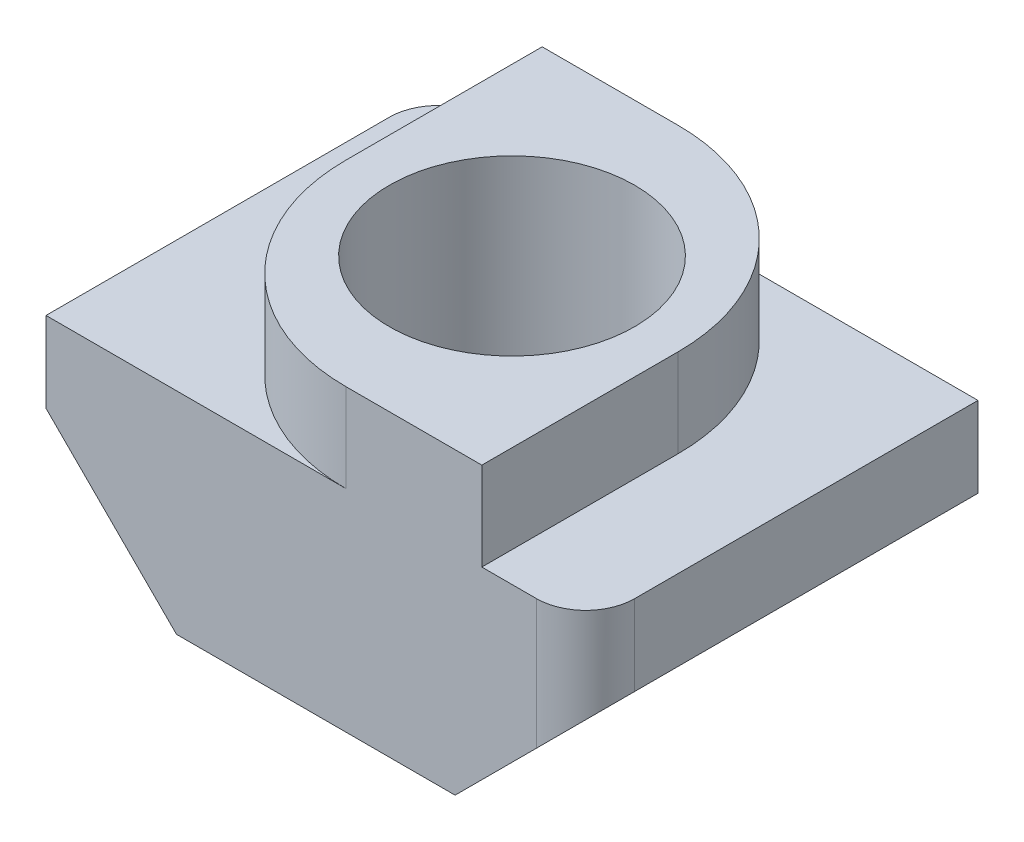
ISO-10303-21;
HEADER;
FILE_DESCRIPTION(('STEP AP214'),'2;1');
FILE_NAME('part.step','',(''),(''),'','','');
FILE_SCHEMA(('AUTOMOTIVE_DESIGN { 1 0 10303 214 1 1 1 1 }'));
ENDSEC;
DATA;
#1=APPLICATION_CONTEXT('core data for automotive mechanical design processes');
#2=APPLICATION_PROTOCOL_DEFINITION('international standard','automotive_design',2000,#1);
#3=PRODUCT_CONTEXT('',#1,'mechanical');
#4=PRODUCT('Part','Part','',(#3));
#5=PRODUCT_RELATED_PRODUCT_CATEGORY('part','',(#4));
#6=PRODUCT_DEFINITION_FORMATION('','',#4);
#7=PRODUCT_DEFINITION_CONTEXT('part definition',#1,'design');
#8=PRODUCT_DEFINITION('design','',#6,#7);
#9=PRODUCT_DEFINITION_SHAPE('','',#8);
#10=(LENGTH_UNIT() NAMED_UNIT(*) SI_UNIT(.MILLI.,.METRE.));
#11=(NAMED_UNIT(*) PLANE_ANGLE_UNIT() SI_UNIT($,.RADIAN.));
#12=(NAMED_UNIT(*) SI_UNIT($,.STERADIAN.) SOLID_ANGLE_UNIT());
#13=UNCERTAINTY_MEASURE_WITH_UNIT(LENGTH_MEASURE(1.E-05),#10,'distance_accuracy_value','');
#14=(GEOMETRIC_REPRESENTATION_CONTEXT(3) GLOBAL_UNCERTAINTY_ASSIGNED_CONTEXT((#13)) GLOBAL_UNIT_ASSIGNED_CONTEXT((#10,
#11,#12)) REPRESENTATION_CONTEXT('',''));
#15=CARTESIAN_POINT('',(0.,0.,0.));
#16=DIRECTION('',(0.,0.,1.));
#17=DIRECTION('',(1.,0.,0.));
#18=AXIS2_PLACEMENT_3D('',#15,#16,#17);
#19=CARTESIAN_POINT('',(0.,4.3,0.));
#20=DIRECTION('',(0.,-1.,0.));
#21=DIRECTION('',(0.,0.,-1.));
#22=AXIS2_PLACEMENT_3D('',#19,#20,#21);
#23=PLANE('',#22);
#24=DIRECTION('',(1.,0.,0.));
#25=VECTOR('',#24,1.);
#26=CARTESIAN_POINT('',(-5.5,4.3,4.));
#27=LINE('',#26,#25);
#28=CARTESIAN_POINT('',(3.385,4.3,4.));
#29=VERTEX_POINT('',#28);
#30=CARTESIAN_POINT('',(4.5,4.3,4.));
#31=VERTEX_POINT('',#30);
#32=EDGE_CURVE('E255',#29,#31,#27,.T.);
#33=ORIENTED_EDGE('',*,*,#32,.T.);
#34=CARTESIAN_POINT('',(4.5,4.3,3.));
#35=DIRECTION('',(0.,-1.,0.));
#36=DIRECTION('',(0.,0.,-1.));
#37=AXIS2_PLACEMENT_3D('',#34,#35,#36);
#38=CIRCLE('',#37,1.);
#39=CARTESIAN_POINT('',(5.5,4.3,3.));
#40=VERTEX_POINT('',#39);
#41=EDGE_CURVE('E203',#31,#40,#38,.F.);
#42=ORIENTED_EDGE('',*,*,#41,.T.);
#43=DIRECTION('',(0.,0.,-1.));
#44=VECTOR('',#43,1.);
#45=CARTESIAN_POINT('',(5.5,4.3,4.));
#46=LINE('',#45,#44);
#47=CARTESIAN_POINT('',(5.5,4.3,-4.));
#48=VERTEX_POINT('',#47);
#49=EDGE_CURVE('E233',#40,#48,#46,.T.);
#50=ORIENTED_EDGE('',*,*,#49,.T.);
#51=DIRECTION('',(-1.,0.,0.));
#52=VECTOR('',#51,1.);
#53=CARTESIAN_POINT('',(-5.5,4.3,-4.));
#54=LINE('',#53,#52);
#55=CARTESIAN_POINT('',(-0.615,4.3,-4.));
#56=VERTEX_POINT('',#55);
#57=EDGE_CURVE('E243',#48,#56,#54,.T.);
#58=ORIENTED_EDGE('',*,*,#57,.T.);
#59=CARTESIAN_POINT('',(-0.615,4.3,0.));
#60=DIRECTION('',(0.,-1.,0.));
#61=DIRECTION('',(0.,0.,-1.));
#62=AXIS2_PLACEMENT_3D('',#59,#60,#61);
#63=CIRCLE('',#62,4.);
#64=CARTESIAN_POINT('',(3.385,4.3,0.));
#65=VERTEX_POINT('',#64);
#66=EDGE_CURVE('E192',#56,#65,#63,.T.);
#67=ORIENTED_EDGE('',*,*,#66,.T.);
#68=DIRECTION('',(0.,0.,-1.));
#69=VECTOR('',#68,1.);
#70=CARTESIAN_POINT('',(3.385,4.3,4.));
#71=LINE('',#70,#69);
#72=EDGE_CURVE('E169',#29,#65,#71,.T.);
#73=ORIENTED_EDGE('',*,*,#72,.F.);
#74=EDGE_LOOP('',(#33,#42,#50,#58,#67,#73));
#75=FACE_BOUND('',#74,.T.);
#76=ADVANCED_FACE('F32',(#75),#23,.F.);
#77=CARTESIAN_POINT('',(-3.385,4.3,-4.));
#78=VERTEX_POINT('',#77);
#79=CARTESIAN_POINT('',(-4.5,4.3,-4.));
#80=VERTEX_POINT('',#79);
#81=EDGE_CURVE('E150',#78,#80,#54,.T.);
#82=ORIENTED_EDGE('',*,*,#81,.T.);
#83=CARTESIAN_POINT('',(-4.5,4.3,-3.));
#84=DIRECTION('',(0.,-1.,0.));
#85=DIRECTION('',(0.,0.,-1.));
#86=AXIS2_PLACEMENT_3D('',#83,#84,#85);
#87=CIRCLE('',#86,1.);
#88=CARTESIAN_POINT('',(-5.5,4.3,-3.));
#89=VERTEX_POINT('',#88);
#90=EDGE_CURVE('E11',#80,#89,#87,.F.);
#91=ORIENTED_EDGE('',*,*,#90,.T.);
#92=DIRECTION('',(0.,0.,1.));
#93=VECTOR('',#92,1.);
#94=CARTESIAN_POINT('',(-5.5,4.3,4.));
#95=LINE('',#94,#93);
#96=CARTESIAN_POINT('',(-5.5,4.3,4.));
#97=VERTEX_POINT('',#96);
#98=EDGE_CURVE('E215',#89,#97,#95,.T.);
#99=ORIENTED_EDGE('',*,*,#98,.T.);
#100=CARTESIAN_POINT('',(0.615,4.3,4.));
#101=VERTEX_POINT('',#100);
#102=EDGE_CURVE('E249',#97,#101,#27,.T.);
#103=ORIENTED_EDGE('',*,*,#102,.T.);
#104=CARTESIAN_POINT('',(0.615,4.3,0.));
#105=DIRECTION('',(0.,-1.,0.));
#106=DIRECTION('',(0.,0.,-1.));
#107=AXIS2_PLACEMENT_3D('',#104,#105,#106);
#108=CIRCLE('',#107,4.);
#109=CARTESIAN_POINT('',(-3.385,4.3,0.));
#110=VERTEX_POINT('',#109);
#111=EDGE_CURVE('E194',#101,#110,#108,.T.);
#112=ORIENTED_EDGE('',*,*,#111,.T.);
#113=DIRECTION('',(0.,0.,1.));
#114=VECTOR('',#113,1.);
#115=CARTESIAN_POINT('',(-3.385,4.3,4.));
#116=LINE('',#115,#114);
#117=EDGE_CURVE('E173',#78,#110,#116,.T.);
#118=ORIENTED_EDGE('',*,*,#117,.F.);
#119=EDGE_LOOP('',(#82,#91,#99,#103,#112,#118));
#120=FACE_BOUND('',#119,.T.);
#121=ADVANCED_FACE('F264',(#120),#23,.F.);
#122=CARTESIAN_POINT('',(0.,0.,0.));
#123=DIRECTION('',(0.,-1.,0.));
#124=DIRECTION('',(0.,0.,-1.));
#125=AXIS2_PLACEMENT_3D('',#122,#123,#124);
#126=PLANE('',#125);
#127=DIRECTION('',(0.,0.,1.));
#128=VECTOR('',#127,1.);
#129=CARTESIAN_POINT('',(2.84000000000001,0.,-4.));
#130=LINE('',#129,#128);
#131=CARTESIAN_POINT('',(2.84000000000001,0.,-4.));
#132=VERTEX_POINT('',#131);
#133=CARTESIAN_POINT('',(2.84000000000001,0.,4.));
#134=VERTEX_POINT('',#133);
#135=EDGE_CURVE('E341',#132,#134,#130,.T.);
#136=ORIENTED_EDGE('',*,*,#135,.T.);
#137=DIRECTION('',(1.,0.,0.));
#138=VECTOR('',#137,1.);
#139=CARTESIAN_POINT('',(-5.5,0.,4.));
#140=LINE('',#139,#138);
#141=CARTESIAN_POINT('',(-2.84000000000001,0.,4.));
#142=VERTEX_POINT('',#141);
#143=EDGE_CURVE('E235',#142,#134,#140,.T.);
#144=ORIENTED_EDGE('',*,*,#143,.F.);
#145=DIRECTION('',(0.,0.,1.));
#146=VECTOR('',#145,1.);
#147=CARTESIAN_POINT('',(-2.84000000000001,0.,-4.));
#148=LINE('',#147,#146);
#149=CARTESIAN_POINT('',(-2.84000000000001,0.,-4.));
#150=VERTEX_POINT('',#149);
#151=EDGE_CURVE('E223',#150,#142,#148,.T.);
#152=ORIENTED_EDGE('',*,*,#151,.F.);
#153=DIRECTION('',(-1.,0.,0.));
#154=VECTOR('',#153,1.);
#155=CARTESIAN_POINT('',(-5.5,0.,-4.));
#156=LINE('',#155,#154);
#157=EDGE_CURVE('E226',#132,#150,#156,.T.);
#158=ORIENTED_EDGE('',*,*,#157,.F.);
#159=EDGE_LOOP('',(#136,#144,#152,#158));
#160=FACE_BOUND('',#159,.T.);
#161=CARTESIAN_POINT('',(0.,0.,0.));
#162=DIRECTION('',(0.,1.,0.));
#163=DIRECTION('',(0.,0.,1.));
#164=AXIS2_PLACEMENT_3D('',#161,#162,#163);
#165=CIRCLE('',#164,2.5);
#166=CARTESIAN_POINT('',(0.,0.,-2.5));
#167=VERTEX_POINT('',#166);
#168=EDGE_CURVE('E222',#167,#167,#165,.T.);
#169=ORIENTED_EDGE('',*,*,#168,.T.);
#170=EDGE_LOOP('',(#169));
#171=FACE_BOUND('',#170,.T.);
#172=ADVANCED_FACE('F297',(#160,#171),#126,.T.);
#173=CARTESIAN_POINT('',(5.5,4.3,4.));
#174=DIRECTION('',(-1.,0.,0.));
#175=DIRECTION('',(0.,0.,1.));
#176=AXIS2_PLACEMENT_3D('',#173,#174,#175);
#177=PLANE('',#176);
#178=ORIENTED_EDGE('',*,*,#49,.F.);
#179=DIRECTION('',(0.,-1.,0.));
#180=VECTOR('',#179,1.);
#181=CARTESIAN_POINT('',(5.5,4.3,3.));
#182=LINE('',#181,#180);
#183=CARTESIAN_POINT('',(5.5,2.66,3.));
#184=VERTEX_POINT('',#183);
#185=EDGE_CURVE('E196',#40,#184,#182,.T.);
#186=ORIENTED_EDGE('',*,*,#185,.T.);
#187=DIRECTION('',(0.,0.,1.));
#188=VECTOR('',#187,1.);
#189=CARTESIAN_POINT('',(5.5,2.66,-4.));
#190=LINE('',#189,#188);
#191=CARTESIAN_POINT('',(5.5,2.66,-4.));
#192=VERTEX_POINT('',#191);
#193=EDGE_CURVE('E332',#192,#184,#190,.T.);
#194=ORIENTED_EDGE('',*,*,#193,.F.);
#195=DIRECTION('',(0.,-1.,0.));
#196=VECTOR('',#195,1.);
#197=CARTESIAN_POINT('',(5.5,4.3,-4.));
#198=LINE('',#197,#196);
#199=EDGE_CURVE('E183',#48,#192,#198,.T.);
#200=ORIENTED_EDGE('',*,*,#199,.F.);
#201=EDGE_LOOP('',(#178,#186,#194,#200));
#202=FACE_BOUND('',#201,.T.);
#203=ADVANCED_FACE('F303',(#202),#177,.F.);
#204=CARTESIAN_POINT('',(-5.5,4.3,-4.));
#205=DIRECTION('',(0.,0.,1.));
#206=DIRECTION('',(1.,0.,0.));
#207=AXIS2_PLACEMENT_3D('',#204,#205,#206);
#208=PLANE('',#207);
#209=DIRECTION('',(-0.707106781186546,0.707106781186549,0.));
#210=VECTOR('',#209,1.);
#211=CARTESIAN_POINT('',(-5.5,2.66,-4.));
#212=LINE('',#211,#210);
#213=CARTESIAN_POINT('',(-4.5,1.66,-4.));
#214=VERTEX_POINT('',#213);
#215=EDGE_CURVE('E228',#150,#214,#212,.T.);
#216=ORIENTED_EDGE('',*,*,#215,.T.);
#217=DIRECTION('',(0.,-1.,0.));
#218=VECTOR('',#217,1.);
#219=CARTESIAN_POINT('',(-4.5,4.3,-4.));
#220=LINE('',#219,#218);
#221=EDGE_CURVE('E40',#214,#80,#220,.F.);
#222=ORIENTED_EDGE('',*,*,#221,.T.);
#223=ORIENTED_EDGE('',*,*,#81,.F.);
#224=DIRECTION('',(0.,-1.,0.));
#225=VECTOR('',#224,1.);
#226=CARTESIAN_POINT('',(-3.385,6.1,-4.));
#227=LINE('',#226,#225);
#228=CARTESIAN_POINT('',(-3.385,6.1,-4.));
#229=VERTEX_POINT('',#228);
#230=EDGE_CURVE('E148',#229,#78,#227,.T.);
#231=ORIENTED_EDGE('',*,*,#230,.F.);
#232=DIRECTION('',(-1.,0.,0.));
#233=VECTOR('',#232,1.);
#234=CARTESIAN_POINT('',(-3.385,6.1,-4.));
#235=LINE('',#234,#233);
#236=CARTESIAN_POINT('',(-0.615,6.1,-4.));
#237=VERTEX_POINT('',#236);
#238=EDGE_CURVE('E133',#237,#229,#235,.T.);
#239=ORIENTED_EDGE('',*,*,#238,.F.);
#240=DIRECTION('',(0.,-1.,0.));
#241=VECTOR('',#240,1.);
#242=CARTESIAN_POINT('',(-0.615,4.3,-4.));
#243=LINE('',#242,#241);
#244=EDGE_CURVE('E180',#237,#56,#243,.T.);
#245=ORIENTED_EDGE('',*,*,#244,.T.);
#246=ORIENTED_EDGE('',*,*,#57,.F.);
#247=ORIENTED_EDGE('',*,*,#199,.T.);
#248=DIRECTION('',(-0.707106781186547,-0.707106781186548,0.));
#249=VECTOR('',#248,1.);
#250=CARTESIAN_POINT('',(5.5,2.66,-4.));
#251=LINE('',#250,#249);
#252=EDGE_CURVE('E334',#192,#132,#251,.T.);
#253=ORIENTED_EDGE('',*,*,#252,.T.);
#254=ORIENTED_EDGE('',*,*,#157,.T.);
#255=EDGE_LOOP('',(#216,#222,#223,#231,#239,#245,#246,#247,#253,#254));
#256=FACE_BOUND('',#255,.T.);
#257=ADVANCED_FACE('F149',(#256),#208,.F.);
#258=CARTESIAN_POINT('',(-5.5,4.3,4.));
#259=DIRECTION('',(1.,0.,0.));
#260=DIRECTION('',(0.,0.,-1.));
#261=AXIS2_PLACEMENT_3D('',#258,#259,#260);
#262=PLANE('',#261);
#263=ORIENTED_EDGE('',*,*,#98,.F.);
#264=DIRECTION('',(0.,-1.,0.));
#265=VECTOR('',#264,1.);
#266=CARTESIAN_POINT('',(-5.5,4.3,-3.));
#267=LINE('',#266,#265);
#268=CARTESIAN_POINT('',(-5.5,2.66,-3.));
#269=VERTEX_POINT('',#268);
#270=EDGE_CURVE('E205',#89,#269,#267,.T.);
#271=ORIENTED_EDGE('',*,*,#270,.T.);
#272=DIRECTION('',(0.,0.,1.));
#273=VECTOR('',#272,1.);
#274=CARTESIAN_POINT('',(-5.5,2.66,-4.));
#275=LINE('',#274,#273);
#276=CARTESIAN_POINT('',(-5.5,2.66,4.));
#277=VERTEX_POINT('',#276);
#278=EDGE_CURVE('E213',#269,#277,#275,.T.);
#279=ORIENTED_EDGE('',*,*,#278,.T.);
#280=DIRECTION('',(0.,-1.,0.));
#281=VECTOR('',#280,1.);
#282=CARTESIAN_POINT('',(-5.5,4.3,4.));
#283=LINE('',#282,#281);
#284=EDGE_CURVE('E247',#97,#277,#283,.T.);
#285=ORIENTED_EDGE('',*,*,#284,.F.);
#286=EDGE_LOOP('',(#263,#271,#279,#285));
#287=FACE_BOUND('',#286,.T.);
#288=ADVANCED_FACE('F211',(#287),#262,.F.);
#289=CARTESIAN_POINT('',(-5.5,4.3,4.));
#290=DIRECTION('',(0.,0.,-1.));
#291=DIRECTION('',(-1.,0.,0.));
#292=AXIS2_PLACEMENT_3D('',#289,#290,#291);
#293=PLANE('',#292);
#294=DIRECTION('',(-0.707106781186547,-0.707106781186548,0.));
#295=VECTOR('',#294,1.);
#296=CARTESIAN_POINT('',(5.5,2.66,4.));
#297=LINE('',#296,#295);
#298=CARTESIAN_POINT('',(4.5,1.66,4.));
#299=VERTEX_POINT('',#298);
#300=EDGE_CURVE('E153',#299,#134,#297,.T.);
#301=ORIENTED_EDGE('',*,*,#300,.F.);
#302=DIRECTION('',(0.,-1.,0.));
#303=VECTOR('',#302,1.);
#304=CARTESIAN_POINT('',(4.5,4.3,4.));
#305=LINE('',#304,#303);
#306=EDGE_CURVE('E201',#299,#31,#305,.F.);
#307=ORIENTED_EDGE('',*,*,#306,.T.);
#308=ORIENTED_EDGE('',*,*,#32,.F.);
#309=DIRECTION('',(0.,-1.,0.));
#310=VECTOR('',#309,1.);
#311=CARTESIAN_POINT('',(3.385,6.1,4.));
#312=LINE('',#311,#310);
#313=CARTESIAN_POINT('',(3.385,6.1,4.));
#314=VERTEX_POINT('',#313);
#315=EDGE_CURVE('E154',#314,#29,#312,.T.);
#316=ORIENTED_EDGE('',*,*,#315,.F.);
#317=DIRECTION('',(1.,0.,0.));
#318=VECTOR('',#317,1.);
#319=CARTESIAN_POINT('',(-3.385,6.1,4.));
#320=LINE('',#319,#318);
#321=CARTESIAN_POINT('',(0.615,6.1,4.));
#322=VERTEX_POINT('',#321);
#323=EDGE_CURVE('E159',#322,#314,#320,.T.);
#324=ORIENTED_EDGE('',*,*,#323,.F.);
#325=DIRECTION('',(0.,-1.,0.));
#326=VECTOR('',#325,1.);
#327=CARTESIAN_POINT('',(0.615,4.3,4.));
#328=LINE('',#327,#326);
#329=EDGE_CURVE('E188',#322,#101,#328,.T.);
#330=ORIENTED_EDGE('',*,*,#329,.T.);
#331=ORIENTED_EDGE('',*,*,#102,.F.);
#332=ORIENTED_EDGE('',*,*,#284,.T.);
#333=DIRECTION('',(-0.707106781186546,0.707106781186549,0.));
#334=VECTOR('',#333,1.);
#335=CARTESIAN_POINT('',(-5.5,2.66,4.));
#336=LINE('',#335,#334);
#337=EDGE_CURVE('E220',#142,#277,#336,.T.);
#338=ORIENTED_EDGE('',*,*,#337,.F.);
#339=ORIENTED_EDGE('',*,*,#143,.T.);
#340=EDGE_LOOP('',(#301,#307,#308,#316,#324,#330,#331,#332,#338,#339));
#341=FACE_BOUND('',#340,.T.);
#342=ADVANCED_FACE('F267',(#341),#293,.F.);
#343=CARTESIAN_POINT('',(0.,4.3,0.));
#344=DIRECTION('',(0.,-1.,0.));
#345=DIRECTION('',(0.,0.,-1.));
#346=AXIS2_PLACEMENT_3D('',#343,#344,#345);
#347=CYLINDRICAL_SURFACE('',#346,2.5);
#348=CARTESIAN_POINT('',(0.,6.1,0.));
#349=DIRECTION('',(0.,1.,0.));
#350=DIRECTION('',(0.,0.,1.));
#351=AXIS2_PLACEMENT_3D('',#348,#349,#350);
#352=CIRCLE('',#351,2.5);
#353=CARTESIAN_POINT('',(0.,6.1,-2.5));
#354=VERTEX_POINT('',#353);
#355=EDGE_CURVE('E174',#354,#354,#352,.T.);
#356=CARTESIAN_POINT('',(0.,0.,-2.5));
#357=CARTESIAN_POINT('',(0.,0.0635416666666657,-2.5));
#358=CARTESIAN_POINT('',(0.,0.127083333333332,-2.5));
#359=CARTESIAN_POINT('',(0.,0.254166666666666,-2.5));
#360=CARTESIAN_POINT('',(0.,0.317708333333332,-2.5));
#361=CARTESIAN_POINT('',(0.,0.444791666666665,-2.5));
#362=CARTESIAN_POINT('',(0.,0.508333333333332,-2.5));
#363=CARTESIAN_POINT('',(0.,0.635416666666666,-2.5));
#364=CARTESIAN_POINT('',(0.,0.698958333333332,-2.5));
#365=CARTESIAN_POINT('',(0.,0.826041666666665,-2.5));
#366=CARTESIAN_POINT('',(0.,0.889583333333332,-2.5));
#367=CARTESIAN_POINT('',(0.,1.01666666666667,-2.5));
#368=CARTESIAN_POINT('',(0.,1.08020833333333,-2.5));
#369=CARTESIAN_POINT('',(0.,1.20729166666667,-2.5));
#370=CARTESIAN_POINT('',(0.,1.27083333333333,-2.5));
#371=CARTESIAN_POINT('',(0.,1.39791666666667,-2.5));
#372=CARTESIAN_POINT('',(0.,1.46145833333333,-2.5));
#373=CARTESIAN_POINT('',(0.,1.58854166666667,-2.5));
#374=CARTESIAN_POINT('',(0.,1.65208333333333,-2.5));
#375=CARTESIAN_POINT('',(0.,1.77916666666667,-2.5));
#376=CARTESIAN_POINT('',(0.,1.84270833333333,-2.5));
#377=CARTESIAN_POINT('',(0.,1.96979166666667,-2.5));
#378=CARTESIAN_POINT('',(0.,2.03333333333333,-2.5));
#379=CARTESIAN_POINT('',(0.,2.16041666666667,-2.5));
#380=CARTESIAN_POINT('',(0.,2.22395833333333,-2.5));
#381=CARTESIAN_POINT('',(0.,2.35104166666667,-2.5));
#382=CARTESIAN_POINT('',(0.,2.41458333333333,-2.5));
#383=CARTESIAN_POINT('',(0.,2.54166666666667,-2.5));
#384=CARTESIAN_POINT('',(0.,2.60520833333333,-2.5));
#385=CARTESIAN_POINT('',(0.,2.73229166666667,-2.5));
#386=CARTESIAN_POINT('',(0.,2.79583333333333,-2.5));
#387=CARTESIAN_POINT('',(0.,2.92291666666667,-2.5));
#388=CARTESIAN_POINT('',(0.,2.98645833333333,-2.5));
#389=CARTESIAN_POINT('',(0.,3.11354166666667,-2.5));
#390=CARTESIAN_POINT('',(0.,3.17708333333333,-2.5));
#391=CARTESIAN_POINT('',(0.,3.30416666666667,-2.5));
#392=CARTESIAN_POINT('',(0.,3.36770833333333,-2.5));
#393=CARTESIAN_POINT('',(0.,3.49479166666667,-2.5));
#394=CARTESIAN_POINT('',(0.,3.55833333333333,-2.5));
#395=CARTESIAN_POINT('',(0.,3.68541666666667,-2.5));
#396=CARTESIAN_POINT('',(0.,3.74895833333333,-2.5));
#397=CARTESIAN_POINT('',(0.,3.87604166666667,-2.5));
#398=CARTESIAN_POINT('',(0.,3.93958333333333,-2.5));
#399=CARTESIAN_POINT('',(0.,4.06666666666667,-2.5));
#400=CARTESIAN_POINT('',(0.,4.13020833333333,-2.5));
#401=CARTESIAN_POINT('',(0.,4.25729166666667,-2.5));
#402=CARTESIAN_POINT('',(0.,4.32083333333333,-2.5));
#403=CARTESIAN_POINT('',(0.,4.44791666666667,-2.5));
#404=CARTESIAN_POINT('',(0.,4.51145833333333,-2.5));
#405=CARTESIAN_POINT('',(0.,4.63854166666667,-2.5));
#406=CARTESIAN_POINT('',(0.,4.70208333333333,-2.5));
#407=CARTESIAN_POINT('',(0.,4.82916666666667,-2.5));
#408=CARTESIAN_POINT('',(0.,4.89270833333333,-2.5));
#409=CARTESIAN_POINT('',(0.,5.01979166666667,-2.5));
#410=CARTESIAN_POINT('',(0.,5.08333333333333,-2.5));
#411=CARTESIAN_POINT('',(0.,5.21041666666667,-2.5));
#412=CARTESIAN_POINT('',(0.,5.27395833333333,-2.5));
#413=CARTESIAN_POINT('',(0.,5.40104166666667,-2.5));
#414=CARTESIAN_POINT('',(0.,5.46458333333333,-2.5));
#415=CARTESIAN_POINT('',(0.,5.59166666666667,-2.5));
#416=CARTESIAN_POINT('',(0.,5.65520833333333,-2.5));
#417=CARTESIAN_POINT('',(0.,5.78229166666667,-2.5));
#418=CARTESIAN_POINT('',(0.,5.84583333333333,-2.5));
#419=CARTESIAN_POINT('',(0.,5.97291666666667,-2.5));
#420=CARTESIAN_POINT('',(0.,6.03645833333333,-2.5));
#421=CARTESIAN_POINT('',(0.,6.1,-2.5));
#422=B_SPLINE_CURVE_WITH_KNOTS('',3,(#356,#357,#358,#359,#360,#361,#362,#363,#364,#365,#366,
#367,#368,#369,#370,#371,#372,#373,#374,#375,#376,#377,#378,#379,#380,#381,#382,#383,#384,#385,
#386,#387,#388,#389,#390,#391,#392,#393,#394,#395,#396,#397,#398,#399,#400,#401,#402,#403,#404,
#405,#406,#407,#408,#409,#410,#411,#412,#413,#414,#415,#416,#417,#418,#419,#420,#421),
.UNSPECIFIED.,.F.,.F.,(4,2,2,2,2,2,2,2,2,2,2,2,2,2,2,2,2,2,2,2,2,2,2,2,2,2,2,2,2,2,2,2,4),(0.,
0.190625,0.38125,0.571875,0.7625,0.953125,1.14375,1.334375,1.525,1.715625,1.90625,2.096875,
2.2875,2.478125,2.66875,2.859375,3.05,3.240625,3.43125,3.621875,3.8125,4.003125,4.19375,
4.384375,4.575,4.765625,4.95625,5.146875,5.3375,5.528125,5.71875,5.909375,6.1),.UNSPECIFIED.);
#423=EDGE_CURVE('BSEAM278',#167,#354,#422,.T.);
#424=ORIENTED_EDGE('',*,*,#168,.F.);
#425=ORIENTED_EDGE('',*,*,#355,.T.);
#426=ORIENTED_EDGE('',*,*,#423,.T.);
#427=ORIENTED_EDGE('',*,*,#423,.F.);
#428=EDGE_LOOP('',(#424,#426,#425,#427));
#429=FACE_BOUND('',#428,.T.);
#430=ADVANCED_FACE('F278',(#429),#347,.F.);
#431=CARTESIAN_POINT('',(-5.5,2.66,-4.));
#432=DIRECTION('',(0.707106781186549,0.707106781186546,0.));
#433=DIRECTION('',(-0.707106781186546,0.707106781186549,0.));
#434=AXIS2_PLACEMENT_3D('',#431,#432,#433);
#435=PLANE('',#434);
#436=ORIENTED_EDGE('',*,*,#278,.F.);
#437=CARTESIAN_POINT('',(-4.5,1.66,-3.));
#438=DIRECTION('',(0.707106781186549,0.707106781186546,0.));
#439=DIRECTION('',(0.707106781186546,-0.707106781186549,0.));
#440=AXIS2_PLACEMENT_3D('',#437,#438,#439);
#441=ELLIPSE('',#440,1.4142135623731,1.);
#442=EDGE_CURVE('E54',#269,#214,#441,.F.);
#443=ORIENTED_EDGE('',*,*,#442,.T.);
#444=ORIENTED_EDGE('',*,*,#215,.F.);
#445=ORIENTED_EDGE('',*,*,#151,.T.);
#446=ORIENTED_EDGE('',*,*,#337,.T.);
#447=EDGE_LOOP('',(#436,#443,#444,#445,#446));
#448=FACE_BOUND('',#447,.T.);
#449=ADVANCED_FACE('F218',(#448),#435,.F.);
#450=CARTESIAN_POINT('',(5.5,2.66,-4.));
#451=DIRECTION('',(-0.707106781186549,0.707106781186547,0.));
#452=DIRECTION('',(-0.707106781186547,-0.707106781186549,0.));
#453=AXIS2_PLACEMENT_3D('',#450,#451,#452);
#454=PLANE('',#453);
#455=ORIENTED_EDGE('',*,*,#193,.T.);
#456=CARTESIAN_POINT('',(4.5,1.66,3.));
#457=DIRECTION('',(-0.707106781186549,0.707106781186547,0.));
#458=DIRECTION('',(-0.707106781186547,-0.707106781186549,0.));
#459=AXIS2_PLACEMENT_3D('',#456,#457,#458);
#460=ELLIPSE('',#459,1.4142135623731,1.);
#461=EDGE_CURVE('E199',#184,#299,#460,.F.);
#462=ORIENTED_EDGE('',*,*,#461,.T.);
#463=ORIENTED_EDGE('',*,*,#300,.T.);
#464=ORIENTED_EDGE('',*,*,#135,.F.);
#465=ORIENTED_EDGE('',*,*,#252,.F.);
#466=EDGE_LOOP('',(#455,#462,#463,#464,#465));
#467=FACE_BOUND('',#466,.T.);
#468=ADVANCED_FACE('F281',(#467),#454,.F.);
#469=CARTESIAN_POINT('',(0.,6.1,0.));
#470=DIRECTION('',(0.,-1.,0.));
#471=DIRECTION('',(0.,0.,-1.));
#472=AXIS2_PLACEMENT_3D('',#469,#470,#471);
#473=PLANE('',#472);
#474=DIRECTION('',(0.,0.,-1.));
#475=VECTOR('',#474,1.);
#476=CARTESIAN_POINT('',(3.385,6.1,4.));
#477=LINE('',#476,#475);
#478=CARTESIAN_POINT('',(3.385,6.1,0.));
#479=VERTEX_POINT('',#478);
#480=EDGE_CURVE('E145',#314,#479,#477,.T.);
#481=ORIENTED_EDGE('',*,*,#480,.T.);
#482=CARTESIAN_POINT('',(-0.615,6.1,0.));
#483=DIRECTION('',(0.,-1.,0.));
#484=DIRECTION('',(0.,0.,-1.));
#485=AXIS2_PLACEMENT_3D('',#482,#483,#484);
#486=CIRCLE('',#485,4.);
#487=EDGE_CURVE('E142',#479,#237,#486,.F.);
#488=ORIENTED_EDGE('',*,*,#487,.T.);
#489=ORIENTED_EDGE('',*,*,#238,.T.);
#490=DIRECTION('',(0.,0.,1.));
#491=VECTOR('',#490,1.);
#492=CARTESIAN_POINT('',(-3.385,6.1,4.));
#493=LINE('',#492,#491);
#494=CARTESIAN_POINT('',(-3.385,6.1,0.));
#495=VERTEX_POINT('',#494);
#496=EDGE_CURVE('E139',#229,#495,#493,.T.);
#497=ORIENTED_EDGE('',*,*,#496,.T.);
#498=CARTESIAN_POINT('',(0.615,6.1,0.));
#499=DIRECTION('',(0.,-1.,0.));
#500=DIRECTION('',(0.,0.,-1.));
#501=AXIS2_PLACEMENT_3D('',#498,#499,#500);
#502=CIRCLE('',#501,4.);
#503=EDGE_CURVE('E185',#495,#322,#502,.F.);
#504=ORIENTED_EDGE('',*,*,#503,.T.);
#505=ORIENTED_EDGE('',*,*,#323,.T.);
#506=EDGE_LOOP('',(#481,#488,#489,#497,#504,#505));
#507=FACE_BOUND('',#506,.T.);
#508=ORIENTED_EDGE('',*,*,#355,.F.);
#509=EDGE_LOOP('',(#508));
#510=FACE_BOUND('',#509,.T.);
#511=ADVANCED_FACE('F136',(#507,#510),#473,.F.);
#512=CARTESIAN_POINT('',(3.385,6.1,4.));
#513=DIRECTION('',(-1.,0.,0.));
#514=DIRECTION('',(0.,0.,1.));
#515=AXIS2_PLACEMENT_3D('',#512,#513,#514);
#516=PLANE('',#515);
#517=ORIENTED_EDGE('',*,*,#72,.T.);
#518=DIRECTION('',(0.,-1.,0.));
#519=VECTOR('',#518,1.);
#520=CARTESIAN_POINT('',(3.385,6.1,0.));
#521=LINE('',#520,#519);
#522=EDGE_CURVE('E182',#65,#479,#521,.F.);
#523=ORIENTED_EDGE('',*,*,#522,.T.);
#524=ORIENTED_EDGE('',*,*,#480,.F.);
#525=ORIENTED_EDGE('',*,*,#315,.T.);
#526=EDGE_LOOP('',(#517,#523,#524,#525));
#527=FACE_BOUND('',#526,.T.);
#528=ADVANCED_FACE('F280',(#527),#516,.F.);
#529=CARTESIAN_POINT('',(-3.385,6.1,4.));
#530=DIRECTION('',(1.,0.,0.));
#531=DIRECTION('',(0.,0.,-1.));
#532=AXIS2_PLACEMENT_3D('',#529,#530,#531);
#533=PLANE('',#532);
#534=ORIENTED_EDGE('',*,*,#117,.T.);
#535=DIRECTION('',(0.,-1.,0.));
#536=VECTOR('',#535,1.);
#537=CARTESIAN_POINT('',(-3.385,6.1,0.));
#538=LINE('',#537,#536);
#539=EDGE_CURVE('E158',#110,#495,#538,.F.);
#540=ORIENTED_EDGE('',*,*,#539,.T.);
#541=ORIENTED_EDGE('',*,*,#496,.F.);
#542=ORIENTED_EDGE('',*,*,#230,.T.);
#543=EDGE_LOOP('',(#534,#540,#541,#542));
#544=FACE_BOUND('',#543,.T.);
#545=ADVANCED_FACE('F156',(#544),#533,.F.);
#546=CARTESIAN_POINT('',(-0.615,4.3,0.));
#547=DIRECTION('',(0.,-1.,0.));
#548=DIRECTION('',(0.,0.,-1.));
#549=AXIS2_PLACEMENT_3D('',#546,#547,#548);
#550=CYLINDRICAL_SURFACE('',#549,4.);
#551=ORIENTED_EDGE('',*,*,#487,.F.);
#552=ORIENTED_EDGE('',*,*,#522,.F.);
#553=ORIENTED_EDGE('',*,*,#66,.F.);
#554=ORIENTED_EDGE('',*,*,#244,.F.);
#555=EDGE_LOOP('',(#551,#552,#553,#554));
#556=FACE_BOUND('',#555,.T.);
#557=ADVANCED_FACE('F314',(#556),#550,.T.);
#558=CARTESIAN_POINT('',(0.615,4.3,0.));
#559=DIRECTION('',(0.,-1.,0.));
#560=DIRECTION('',(0.,0.,-1.));
#561=AXIS2_PLACEMENT_3D('',#558,#559,#560);
#562=CYLINDRICAL_SURFACE('',#561,4.);
#563=ORIENTED_EDGE('',*,*,#503,.F.);
#564=ORIENTED_EDGE('',*,*,#539,.F.);
#565=ORIENTED_EDGE('',*,*,#111,.F.);
#566=ORIENTED_EDGE('',*,*,#329,.F.);
#567=EDGE_LOOP('',(#563,#564,#565,#566));
#568=FACE_BOUND('',#567,.T.);
#569=ADVANCED_FACE('F272',(#568),#562,.T.);
#570=CARTESIAN_POINT('',(4.5,4.3,3.));
#571=DIRECTION('',(0.,-1.,0.));
#572=DIRECTION('',(0.,0.,-1.));
#573=AXIS2_PLACEMENT_3D('',#570,#571,#572);
#574=CYLINDRICAL_SURFACE('',#573,1.);
#575=ORIENTED_EDGE('',*,*,#41,.F.);
#576=ORIENTED_EDGE('',*,*,#306,.F.);
#577=ORIENTED_EDGE('',*,*,#461,.F.);
#578=ORIENTED_EDGE('',*,*,#185,.F.);
#579=EDGE_LOOP('',(#575,#576,#577,#578));
#580=FACE_BOUND('',#579,.T.);
#581=ADVANCED_FACE('F319',(#580),#574,.T.);
#582=CARTESIAN_POINT('',(-4.5,4.3,-3.));
#583=DIRECTION('',(0.,-1.,0.));
#584=DIRECTION('',(0.,0.,-1.));
#585=AXIS2_PLACEMENT_3D('',#582,#583,#584);
#586=CYLINDRICAL_SURFACE('',#585,1.);
#587=ORIENTED_EDGE('',*,*,#90,.F.);
#588=ORIENTED_EDGE('',*,*,#221,.F.);
#589=ORIENTED_EDGE('',*,*,#442,.F.);
#590=ORIENTED_EDGE('',*,*,#270,.F.);
#591=EDGE_LOOP('',(#587,#588,#589,#590));
#592=FACE_BOUND('',#591,.T.);
#593=ADVANCED_FACE('F34',(#592),#586,.T.);
#594=CLOSED_SHELL('',(#76,#121,#172,#203,#257,#288,#342,#430,#449,#468,#511,#528,#545,#557,#569,
#581,#593));
#595=MANIFOLD_SOLID_BREP('B2',#594);
#596=ADVANCED_BREP_SHAPE_REPRESENTATION('',(#18,#595),#14);
#597=SHAPE_DEFINITION_REPRESENTATION(#9,#596);
ENDSEC;
END-ISO-10303-21;
